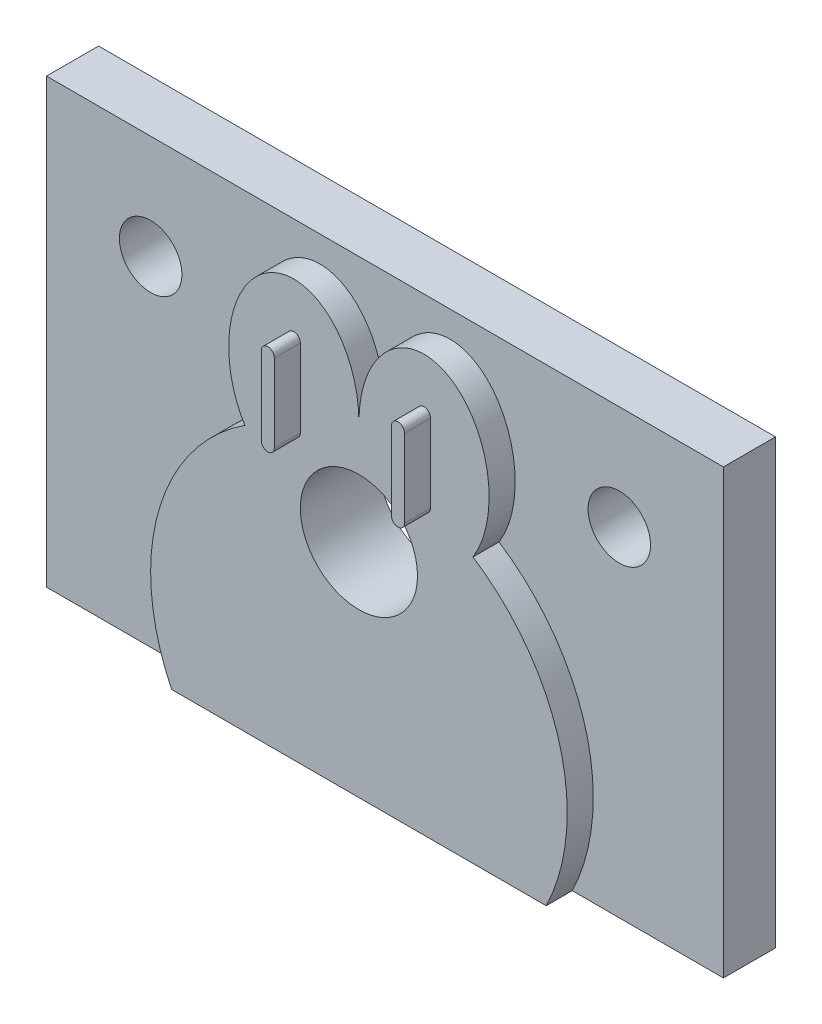
ISO-10303-21;
HEADER;
FILE_DESCRIPTION(('STEP AP214'),'2;1');
FILE_NAME('part.step','',(''),(''),'','','');
FILE_SCHEMA(('AUTOMOTIVE_DESIGN { 1 0 10303 214 1 1 1 1 }'));
ENDSEC;
DATA;
#1=APPLICATION_CONTEXT('core data for automotive mechanical design processes');
#2=APPLICATION_PROTOCOL_DEFINITION('international standard','automotive_design',2000,#1);
#3=PRODUCT_CONTEXT('',#1,'mechanical');
#4=PRODUCT('Part','Part','',(#3));
#5=PRODUCT_RELATED_PRODUCT_CATEGORY('part','',(#4));
#6=PRODUCT_DEFINITION_FORMATION('','',#4);
#7=PRODUCT_DEFINITION_CONTEXT('part definition',#1,'design');
#8=PRODUCT_DEFINITION('design','',#6,#7);
#9=PRODUCT_DEFINITION_SHAPE('','',#8);
#10=(LENGTH_UNIT() NAMED_UNIT(*) SI_UNIT(.MILLI.,.METRE.));
#11=(NAMED_UNIT(*) PLANE_ANGLE_UNIT() SI_UNIT($,.RADIAN.));
#12=(NAMED_UNIT(*) SI_UNIT($,.STERADIAN.) SOLID_ANGLE_UNIT());
#13=UNCERTAINTY_MEASURE_WITH_UNIT(LENGTH_MEASURE(1.E-05),#10,'distance_accuracy_value','');
#14=(GEOMETRIC_REPRESENTATION_CONTEXT(3) GLOBAL_UNCERTAINTY_ASSIGNED_CONTEXT((#13)) GLOBAL_UNIT_ASSIGNED_CONTEXT((#10,
#11,#12)) REPRESENTATION_CONTEXT('',''));
#15=CARTESIAN_POINT('',(0.,0.,0.));
#16=DIRECTION('',(0.,0.,1.));
#17=DIRECTION('',(1.,0.,0.));
#18=AXIS2_PLACEMENT_3D('',#15,#16,#17);
#19=CARTESIAN_POINT('',(-2.5,4.,1.));
#20=DIRECTION('',(0.,0.,1.));
#21=DIRECTION('',(1.,0.,0.));
#22=AXIS2_PLACEMENT_3D('',#19,#20,#21);
#23=PLANE('',#22);
#24=CARTESIAN_POINT('',(0.,0.,1.));
#25=DIRECTION('',(0.,0.,1.));
#26=DIRECTION('',(1.,0.,0.));
#27=AXIS2_PLACEMENT_3D('',#24,#25,#26);
#28=CIRCLE('',#27,2.25);
#29=CARTESIAN_POINT('',(2.25,0.,1.));
#30=VERTEX_POINT('',#29);
#31=EDGE_CURVE('E348',#30,#30,#28,.T.);
#32=ORIENTED_EDGE('',*,*,#31,.F.);
#33=EDGE_LOOP('',(#32));
#34=FACE_BOUND('',#33,.T.);
#35=CARTESIAN_POINT('',(0.,-5.,1.));
#36=DIRECTION('',(0.,0.,1.));
#37=DIRECTION('',(-1.,0.,0.));
#38=AXIS2_PLACEMENT_3D('',#35,#36,#37);
#39=CIRCLE('',#38,8.);
#40=CARTESIAN_POINT('',(-4.38067327137407,1.69400490659134,1.));
#41=VERTEX_POINT('',#40);
#42=CARTESIAN_POINT('',(-7.19374728496908,-8.5,1.));
#43=VERTEX_POINT('',#42);
#44=EDGE_CURVE('E241',#41,#43,#39,.T.);
#45=ORIENTED_EDGE('',*,*,#44,.T.);
#46=DIRECTION('',(1.,0.,0.));
#47=VECTOR('',#46,1.);
#48=CARTESIAN_POINT('',(-7.19374728496908,-8.5,1.));
#49=LINE('',#48,#47);
#50=CARTESIAN_POINT('',(7.19374728496908,-8.5,1.));
#51=VERTEX_POINT('',#50);
#52=EDGE_CURVE('E244',#43,#51,#49,.T.);
#53=ORIENTED_EDGE('',*,*,#52,.T.);
#54=CARTESIAN_POINT('',(0.,-5.,1.));
#55=DIRECTION('',(0.,0.,1.));
#56=DIRECTION('',(-1.,0.,0.));
#57=AXIS2_PLACEMENT_3D('',#54,#55,#56);
#58=CIRCLE('',#57,8.);
#59=CARTESIAN_POINT('',(4.38067327137405,1.69400490659134,1.));
#60=VERTEX_POINT('',#59);
#61=EDGE_CURVE('E247',#51,#60,#58,.T.);
#62=ORIENTED_EDGE('',*,*,#61,.T.);
#63=CARTESIAN_POINT('',(2.5,4.,1.));
#64=DIRECTION('',(0.,0.,1.));
#65=DIRECTION('',(0.,-1.,0.));
#66=AXIS2_PLACEMENT_3D('',#63,#64,#65);
#67=ELLIPSE('',#66,3.5,2.5);
#68=CARTESIAN_POINT('',(0.,4.,1.));
#69=VERTEX_POINT('',#68);
#70=EDGE_CURVE('E249',#60,#69,#67,.T.);
#71=ORIENTED_EDGE('',*,*,#70,.T.);
#72=CARTESIAN_POINT('',(-2.5,4.,1.));
#73=DIRECTION('',(0.,0.,1.));
#74=DIRECTION('',(0.,-1.,0.));
#75=AXIS2_PLACEMENT_3D('',#72,#73,#74);
#76=ELLIPSE('',#75,3.5,2.5);
#77=EDGE_CURVE('E252',#69,#41,#76,.T.);
#78=ORIENTED_EDGE('',*,*,#77,.T.);
#79=EDGE_LOOP('',(#45,#53,#62,#71,#78));
#80=FACE_BOUND('',#79,.T.);
#81=DIRECTION('',(0.,1.,0.));
#82=VECTOR('',#81,1.);
#83=CARTESIAN_POINT('',(-2.25000000000001,2.49999999999999,1.));
#84=LINE('',#83,#82);
#85=CARTESIAN_POINT('',(-2.25000000000001,2.49999999999999,1.));
#86=VERTEX_POINT('',#85);
#87=CARTESIAN_POINT('',(-2.25000000000001,5.49999999999999,1.));
#88=VERTEX_POINT('',#87);
#89=EDGE_CURVE('E227',#86,#88,#84,.T.);
#90=ORIENTED_EDGE('',*,*,#89,.F.);
#91=CARTESIAN_POINT('',(-2.50000000000001,2.49999999999999,1.));
#92=DIRECTION('',(0.,0.,1.));
#93=DIRECTION('',(1.,0.,0.));
#94=AXIS2_PLACEMENT_3D('',#91,#92,#93);
#95=CIRCLE('',#94,0.250000000000001);
#96=CARTESIAN_POINT('',(-2.75000000000002,2.49999999999999,1.));
#97=VERTEX_POINT('',#96);
#98=EDGE_CURVE('E213',#97,#86,#95,.T.);
#99=ORIENTED_EDGE('',*,*,#98,.F.);
#100=DIRECTION('',(0.,-1.,0.));
#101=VECTOR('',#100,1.);
#102=CARTESIAN_POINT('',(-2.75000000000002,2.49999999999999,1.));
#103=LINE('',#102,#101);
#104=CARTESIAN_POINT('',(-2.75000000000002,5.49999999999999,1.));
#105=VERTEX_POINT('',#104);
#106=EDGE_CURVE('E218',#105,#97,#103,.T.);
#107=ORIENTED_EDGE('',*,*,#106,.F.);
#108=CARTESIAN_POINT('',(-2.50000000000002,5.49999999999999,1.));
#109=DIRECTION('',(0.,0.,1.));
#110=DIRECTION('',(1.,0.,0.));
#111=AXIS2_PLACEMENT_3D('',#108,#109,#110);
#112=CIRCLE('',#111,0.250000000000001);
#113=EDGE_CURVE('E229',#88,#105,#112,.T.);
#114=ORIENTED_EDGE('',*,*,#113,.F.);
#115=EDGE_LOOP('',(#90,#99,#107,#114));
#116=FACE_BOUND('',#115,.T.);
#117=DIRECTION('',(0.,1.,0.));
#118=VECTOR('',#117,1.);
#119=CARTESIAN_POINT('',(2.74999999999999,2.49999999999999,1.));
#120=LINE('',#119,#118);
#121=CARTESIAN_POINT('',(2.74999999999999,2.49999999999999,1.));
#122=VERTEX_POINT('',#121);
#123=CARTESIAN_POINT('',(2.74999999999999,5.49999999999999,1.));
#124=VERTEX_POINT('',#123);
#125=EDGE_CURVE('E184',#122,#124,#120,.T.);
#126=ORIENTED_EDGE('',*,*,#125,.F.);
#127=CARTESIAN_POINT('',(2.49999999999999,2.49999999999999,1.));
#128=DIRECTION('',(0.,0.,1.));
#129=DIRECTION('',(1.,0.,0.));
#130=AXIS2_PLACEMENT_3D('',#127,#128,#129);
#131=CIRCLE('',#130,0.25);
#132=CARTESIAN_POINT('',(2.24999999999999,2.49999999999999,1.));
#133=VERTEX_POINT('',#132);
#134=EDGE_CURVE('E181',#133,#122,#131,.T.);
#135=ORIENTED_EDGE('',*,*,#134,.F.);
#136=DIRECTION('',(0.,-1.,0.));
#137=VECTOR('',#136,1.);
#138=CARTESIAN_POINT('',(2.24999999999999,2.49999999999999,1.));
#139=LINE('',#138,#137);
#140=CARTESIAN_POINT('',(2.24999999999999,5.49999999999999,1.));
#141=VERTEX_POINT('',#140);
#142=EDGE_CURVE('E194',#141,#133,#139,.T.);
#143=ORIENTED_EDGE('',*,*,#142,.F.);
#144=CARTESIAN_POINT('',(2.49999999999999,5.49999999999999,1.));
#145=DIRECTION('',(0.,0.,1.));
#146=DIRECTION('',(1.,0.,0.));
#147=AXIS2_PLACEMENT_3D('',#144,#145,#146);
#148=CIRCLE('',#147,0.25);
#149=EDGE_CURVE('E202',#124,#141,#148,.T.);
#150=ORIENTED_EDGE('',*,*,#149,.F.);
#151=EDGE_LOOP('',(#126,#135,#143,#150));
#152=FACE_BOUND('',#151,.T.);
#153=ADVANCED_FACE('F33',(#34,#80,#116,#152),#23,.T.);
#154=CARTESIAN_POINT('',(0.,-5.,1.));
#155=DIRECTION('',(0.,0.,-1.));
#156=DIRECTION('',(-1.,0.,0.));
#157=AXIS2_PLACEMENT_3D('',#154,#155,#156);
#158=CYLINDRICAL_SURFACE('',#157,8.);
#159=CARTESIAN_POINT('',(0.,-5.,0.));
#160=DIRECTION('',(0.,0.,1.));
#161=DIRECTION('',(-1.,0.,0.));
#162=AXIS2_PLACEMENT_3D('',#159,#160,#161);
#163=CIRCLE('',#162,8.);
#164=CARTESIAN_POINT('',(-4.38067327137407,1.69400490659134,0.));
#165=VERTEX_POINT('',#164);
#166=CARTESIAN_POINT('',(-7.19374728496908,-8.5,0.));
#167=VERTEX_POINT('',#166);
#168=EDGE_CURVE('E240',#165,#167,#163,.T.);
#169=ORIENTED_EDGE('',*,*,#168,.T.);
#170=DIRECTION('',(0.,0.,-1.));
#171=VECTOR('',#170,1.);
#172=CARTESIAN_POINT('',(-7.19374728496908,-8.5,1.));
#173=LINE('',#172,#171);
#174=EDGE_CURVE('E11',#43,#167,#173,.T.);
#175=ORIENTED_EDGE('',*,*,#174,.F.);
#176=ORIENTED_EDGE('',*,*,#44,.F.);
#177=DIRECTION('',(0.,0.,-1.));
#178=VECTOR('',#177,1.);
#179=CARTESIAN_POINT('',(-4.38067327137407,1.69400490659134,1.));
#180=LINE('',#179,#178);
#181=EDGE_CURVE('E395',#41,#165,#180,.T.);
#182=ORIENTED_EDGE('',*,*,#181,.T.);
#183=EDGE_LOOP('',(#169,#175,#176,#182));
#184=FACE_BOUND('',#183,.T.);
#185=ADVANCED_FACE('F35',(#184),#158,.T.);
#186=CARTESIAN_POINT('',(-7.19374728496908,-8.5,1.));
#187=DIRECTION('',(0.,1.,0.));
#188=DIRECTION('',(-1.,0.,0.));
#189=AXIS2_PLACEMENT_3D('',#186,#187,#188);
#190=PLANE('',#189);
#191=ORIENTED_EDGE('',*,*,#174,.T.);
#192=DIRECTION('',(-1.,0.,0.));
#193=VECTOR('',#192,1.);
#194=CARTESIAN_POINT('',(-13.,-8.5,0.));
#195=LINE('',#194,#193);
#196=CARTESIAN_POINT('',(-13.,-8.5,0.));
#197=VERTEX_POINT('',#196);
#198=EDGE_CURVE('E371',#167,#197,#195,.T.);
#199=ORIENTED_EDGE('',*,*,#198,.T.);
#200=DIRECTION('',(0.,0.,1.));
#201=VECTOR('',#200,1.);
#202=CARTESIAN_POINT('',(-13.,-8.5,-2.));
#203=LINE('',#202,#201);
#204=CARTESIAN_POINT('',(-13.,-8.5,-2.));
#205=VERTEX_POINT('',#204);
#206=EDGE_CURVE('E162',#205,#197,#203,.T.);
#207=ORIENTED_EDGE('',*,*,#206,.F.);
#208=DIRECTION('',(-1.,0.,0.));
#209=VECTOR('',#208,1.);
#210=CARTESIAN_POINT('',(-13.,-8.5,-2.));
#211=LINE('',#210,#209);
#212=CARTESIAN_POINT('',(13.,-8.5,-2.));
#213=VERTEX_POINT('',#212);
#214=EDGE_CURVE('E154',#213,#205,#211,.T.);
#215=ORIENTED_EDGE('',*,*,#214,.F.);
#216=DIRECTION('',(0.,0.,1.));
#217=VECTOR('',#216,1.);
#218=CARTESIAN_POINT('',(13.,-8.5,-2.));
#219=LINE('',#218,#217);
#220=CARTESIAN_POINT('',(13.,-8.5,0.));
#221=VERTEX_POINT('',#220);
#222=EDGE_CURVE('E159',#213,#221,#219,.T.);
#223=ORIENTED_EDGE('',*,*,#222,.T.);
#224=CARTESIAN_POINT('',(7.19374728496908,-8.5,0.));
#225=VERTEX_POINT('',#224);
#226=EDGE_CURVE('E372',#221,#225,#195,.T.);
#227=ORIENTED_EDGE('',*,*,#226,.T.);
#228=DIRECTION('',(0.,0.,-1.));
#229=VECTOR('',#228,1.);
#230=CARTESIAN_POINT('',(7.19374728496908,-8.5,1.));
#231=LINE('',#230,#229);
#232=EDGE_CURVE('E41',#51,#225,#231,.T.);
#233=ORIENTED_EDGE('',*,*,#232,.F.);
#234=ORIENTED_EDGE('',*,*,#52,.F.);
#235=EDGE_LOOP('',(#191,#199,#207,#215,#223,#227,#233,#234));
#236=FACE_BOUND('',#235,.T.);
#237=ADVANCED_FACE('F156',(#236),#190,.F.);
#238=CARTESIAN_POINT('',(0.,-5.,1.));
#239=DIRECTION('',(0.,0.,-1.));
#240=DIRECTION('',(-1.,0.,0.));
#241=AXIS2_PLACEMENT_3D('',#238,#239,#240);
#242=CYLINDRICAL_SURFACE('',#241,8.);
#243=CARTESIAN_POINT('',(0.,-5.,0.));
#244=DIRECTION('',(0.,0.,1.));
#245=DIRECTION('',(-1.,0.,0.));
#246=AXIS2_PLACEMENT_3D('',#243,#244,#245);
#247=CIRCLE('',#246,8.);
#248=CARTESIAN_POINT('',(4.38067327137405,1.69400490659134,0.));
#249=VERTEX_POINT('',#248);
#250=EDGE_CURVE('E383',#225,#249,#247,.T.);
#251=ORIENTED_EDGE('',*,*,#250,.T.);
#252=DIRECTION('',(0.,0.,-1.));
#253=VECTOR('',#252,1.);
#254=CARTESIAN_POINT('',(4.38067327137405,1.69400490659134,1.));
#255=LINE('',#254,#253);
#256=EDGE_CURVE('E389',#60,#249,#255,.T.);
#257=ORIENTED_EDGE('',*,*,#256,.F.);
#258=ORIENTED_EDGE('',*,*,#61,.F.);
#259=ORIENTED_EDGE('',*,*,#232,.T.);
#260=EDGE_LOOP('',(#251,#257,#258,#259));
#261=FACE_BOUND('',#260,.T.);
#262=ADVANCED_FACE('F261',(#261),#242,.T.);
#263=DIRECTION('',(0.,0.,-1.));
#264=VECTOR('',#263,1.);
#265=SURFACE_OF_LINEAR_EXTRUSION('',#67,#264);
#266=CARTESIAN_POINT('',(2.5,4.,0.));
#267=DIRECTION('',(0.,0.,1.));
#268=DIRECTION('',(0.,-1.,0.));
#269=AXIS2_PLACEMENT_3D('',#266,#267,#268);
#270=ELLIPSE('',#269,3.5,2.5);
#271=CARTESIAN_POINT('',(0.,4.,0.));
#272=VERTEX_POINT('',#271);
#273=EDGE_CURVE('E400',#249,#272,#270,.T.);
#274=ORIENTED_EDGE('',*,*,#273,.T.);
#275=DIRECTION('',(0.,0.,-1.));
#276=VECTOR('',#275,1.);
#277=CARTESIAN_POINT('',(0.,4.,1.));
#278=LINE('',#277,#276);
#279=EDGE_CURVE('E390',#69,#272,#278,.T.);
#280=ORIENTED_EDGE('',*,*,#279,.F.);
#281=ORIENTED_EDGE('',*,*,#70,.F.);
#282=ORIENTED_EDGE('',*,*,#256,.T.);
#283=EDGE_LOOP('',(#274,#280,#281,#282));
#284=FACE_BOUND('',#283,.T.);
#285=ADVANCED_FACE('F256',(#284),#265,.F.);
#286=DIRECTION('',(0.,0.,-1.));
#287=VECTOR('',#286,1.);
#288=SURFACE_OF_LINEAR_EXTRUSION('',#76,#287);
#289=CARTESIAN_POINT('',(-2.5,4.,0.));
#290=DIRECTION('',(0.,0.,1.));
#291=DIRECTION('',(0.,-1.,0.));
#292=AXIS2_PLACEMENT_3D('',#289,#290,#291);
#293=ELLIPSE('',#292,3.5,2.5);
#294=EDGE_CURVE('E245',#272,#165,#293,.T.);
#295=ORIENTED_EDGE('',*,*,#294,.T.);
#296=ORIENTED_EDGE('',*,*,#181,.F.);
#297=ORIENTED_EDGE('',*,*,#77,.F.);
#298=ORIENTED_EDGE('',*,*,#279,.T.);
#299=EDGE_LOOP('',(#295,#296,#297,#298));
#300=FACE_BOUND('',#299,.T.);
#301=ADVANCED_FACE('F260',(#300),#288,.F.);
#302=CARTESIAN_POINT('',(-2.50000000000001,2.49999999999999,2.));
#303=DIRECTION('',(0.,0.,-1.));
#304=DIRECTION('',(-1.,0.,0.));
#305=AXIS2_PLACEMENT_3D('',#302,#303,#304);
#306=CYLINDRICAL_SURFACE('',#305,0.250000000000001);
#307=ORIENTED_EDGE('',*,*,#98,.T.);
#308=DIRECTION('',(0.,0.,-1.));
#309=VECTOR('',#308,1.);
#310=CARTESIAN_POINT('',(-2.25000000000001,2.49999999999999,2.));
#311=LINE('',#310,#309);
#312=CARTESIAN_POINT('',(-2.25000000000001,2.49999999999999,2.));
#313=VERTEX_POINT('',#312);
#314=EDGE_CURVE('E238',#313,#86,#311,.T.);
#315=ORIENTED_EDGE('',*,*,#314,.F.);
#316=CARTESIAN_POINT('',(-2.50000000000001,2.49999999999999,2.));
#317=DIRECTION('',(0.,0.,1.));
#318=DIRECTION('',(1.,0.,0.));
#319=AXIS2_PLACEMENT_3D('',#316,#317,#318);
#320=CIRCLE('',#319,0.250000000000001);
#321=CARTESIAN_POINT('',(-2.75000000000002,2.49999999999999,2.));
#322=VERTEX_POINT('',#321);
#323=EDGE_CURVE('E214',#322,#313,#320,.T.);
#324=ORIENTED_EDGE('',*,*,#323,.F.);
#325=DIRECTION('',(0.,0.,-1.));
#326=VECTOR('',#325,1.);
#327=CARTESIAN_POINT('',(-2.75000000000002,2.49999999999999,2.));
#328=LINE('',#327,#326);
#329=EDGE_CURVE('E224',#322,#97,#328,.T.);
#330=ORIENTED_EDGE('',*,*,#329,.T.);
#331=EDGE_LOOP('',(#307,#315,#324,#330));
#332=FACE_BOUND('',#331,.T.);
#333=ADVANCED_FACE('F278',(#332),#306,.T.);
#334=CARTESIAN_POINT('',(-2.25000000000001,2.49999999999999,2.));
#335=DIRECTION('',(-1.,0.,0.));
#336=DIRECTION('',(0.,-1.,0.));
#337=AXIS2_PLACEMENT_3D('',#334,#335,#336);
#338=PLANE('',#337);
#339=ORIENTED_EDGE('',*,*,#89,.T.);
#340=DIRECTION('',(0.,0.,-1.));
#341=VECTOR('',#340,1.);
#342=CARTESIAN_POINT('',(-2.25000000000001,5.49999999999999,2.));
#343=LINE('',#342,#341);
#344=CARTESIAN_POINT('',(-2.25000000000001,5.49999999999999,2.));
#345=VERTEX_POINT('',#344);
#346=EDGE_CURVE('E235',#345,#88,#343,.T.);
#347=ORIENTED_EDGE('',*,*,#346,.F.);
#348=DIRECTION('',(0.,1.,0.));
#349=VECTOR('',#348,1.);
#350=CARTESIAN_POINT('',(-2.25000000000001,2.49999999999999,2.));
#351=LINE('',#350,#349);
#352=EDGE_CURVE('E217',#313,#345,#351,.T.);
#353=ORIENTED_EDGE('',*,*,#352,.F.);
#354=ORIENTED_EDGE('',*,*,#314,.T.);
#355=EDGE_LOOP('',(#339,#347,#353,#354));
#356=FACE_BOUND('',#355,.T.);
#357=ADVANCED_FACE('F281',(#356),#338,.F.);
#358=CARTESIAN_POINT('',(-2.50000000000002,5.49999999999999,2.));
#359=DIRECTION('',(0.,0.,-1.));
#360=DIRECTION('',(-1.,0.,0.));
#361=AXIS2_PLACEMENT_3D('',#358,#359,#360);
#362=CYLINDRICAL_SURFACE('',#361,0.250000000000001);
#363=ORIENTED_EDGE('',*,*,#113,.T.);
#364=DIRECTION('',(0.,0.,-1.));
#365=VECTOR('',#364,1.);
#366=CARTESIAN_POINT('',(-2.75000000000002,5.49999999999999,2.));
#367=LINE('',#366,#365);
#368=CARTESIAN_POINT('',(-2.75000000000002,5.49999999999999,2.));
#369=VERTEX_POINT('',#368);
#370=EDGE_CURVE('E56',#369,#105,#367,.T.);
#371=ORIENTED_EDGE('',*,*,#370,.F.);
#372=CARTESIAN_POINT('',(-2.50000000000002,5.49999999999999,2.));
#373=DIRECTION('',(0.,0.,1.));
#374=DIRECTION('',(1.,0.,0.));
#375=AXIS2_PLACEMENT_3D('',#372,#373,#374);
#376=CIRCLE('',#375,0.250000000000001);
#377=EDGE_CURVE('E220',#345,#369,#376,.T.);
#378=ORIENTED_EDGE('',*,*,#377,.F.);
#379=ORIENTED_EDGE('',*,*,#346,.T.);
#380=EDGE_LOOP('',(#363,#371,#378,#379));
#381=FACE_BOUND('',#380,.T.);
#382=ADVANCED_FACE('F285',(#381),#362,.T.);
#383=CARTESIAN_POINT('',(-2.75000000000002,2.49999999999999,2.));
#384=DIRECTION('',(1.,0.,0.));
#385=DIRECTION('',(0.,1.,0.));
#386=AXIS2_PLACEMENT_3D('',#383,#384,#385);
#387=PLANE('',#386);
#388=ORIENTED_EDGE('',*,*,#106,.T.);
#389=ORIENTED_EDGE('',*,*,#329,.F.);
#390=DIRECTION('',(0.,-1.,0.));
#391=VECTOR('',#390,1.);
#392=CARTESIAN_POINT('',(-2.75000000000002,2.49999999999999,2.));
#393=LINE('',#392,#391);
#394=EDGE_CURVE('E222',#369,#322,#393,.T.);
#395=ORIENTED_EDGE('',*,*,#394,.F.);
#396=ORIENTED_EDGE('',*,*,#370,.T.);
#397=EDGE_LOOP('',(#388,#389,#395,#396));
#398=FACE_BOUND('',#397,.T.);
#399=ADVANCED_FACE('F289',(#398),#387,.F.);
#400=CARTESIAN_POINT('',(-2.50000000000001,2.49999999999999,2.));
#401=DIRECTION('',(0.,0.,1.));
#402=DIRECTION('',(1.,0.,0.));
#403=AXIS2_PLACEMENT_3D('',#400,#401,#402);
#404=PLANE('',#403);
#405=ORIENTED_EDGE('',*,*,#323,.T.);
#406=ORIENTED_EDGE('',*,*,#352,.T.);
#407=ORIENTED_EDGE('',*,*,#377,.T.);
#408=ORIENTED_EDGE('',*,*,#394,.T.);
#409=EDGE_LOOP('',(#405,#406,#407,#408));
#410=FACE_BOUND('',#409,.T.);
#411=ADVANCED_FACE('F293',(#410),#404,.T.);
#412=CARTESIAN_POINT('',(2.49999999999999,2.49999999999999,2.));
#413=DIRECTION('',(0.,0.,-1.));
#414=DIRECTION('',(-1.,0.,0.));
#415=AXIS2_PLACEMENT_3D('',#412,#413,#414);
#416=CYLINDRICAL_SURFACE('',#415,0.25);
#417=ORIENTED_EDGE('',*,*,#134,.T.);
#418=DIRECTION('',(0.,0.,-1.));
#419=VECTOR('',#418,1.);
#420=CARTESIAN_POINT('',(2.74999999999999,2.49999999999999,2.));
#421=LINE('',#420,#419);
#422=CARTESIAN_POINT('',(2.74999999999999,2.49999999999999,2.));
#423=VERTEX_POINT('',#422);
#424=EDGE_CURVE('E211',#423,#122,#421,.T.);
#425=ORIENTED_EDGE('',*,*,#424,.F.);
#426=CARTESIAN_POINT('',(2.49999999999999,2.49999999999999,2.));
#427=DIRECTION('',(0.,0.,1.));
#428=DIRECTION('',(1.,0.,0.));
#429=AXIS2_PLACEMENT_3D('',#426,#427,#428);
#430=CIRCLE('',#429,0.25);
#431=CARTESIAN_POINT('',(2.24999999999999,2.49999999999999,2.));
#432=VERTEX_POINT('',#431);
#433=EDGE_CURVE('E190',#432,#423,#430,.T.);
#434=ORIENTED_EDGE('',*,*,#433,.F.);
#435=DIRECTION('',(0.,0.,-1.));
#436=VECTOR('',#435,1.);
#437=CARTESIAN_POINT('',(2.24999999999999,2.49999999999999,2.));
#438=LINE('',#437,#436);
#439=EDGE_CURVE('E199',#432,#133,#438,.T.);
#440=ORIENTED_EDGE('',*,*,#439,.T.);
#441=EDGE_LOOP('',(#417,#425,#434,#440));
#442=FACE_BOUND('',#441,.T.);
#443=ADVANCED_FACE('F296',(#442),#416,.T.);
#444=CARTESIAN_POINT('',(2.74999999999999,2.49999999999999,2.));
#445=DIRECTION('',(-1.,0.,0.));
#446=DIRECTION('',(0.,-1.,0.));
#447=AXIS2_PLACEMENT_3D('',#444,#445,#446);
#448=PLANE('',#447);
#449=ORIENTED_EDGE('',*,*,#125,.T.);
#450=DIRECTION('',(0.,0.,-1.));
#451=VECTOR('',#450,1.);
#452=CARTESIAN_POINT('',(2.74999999999999,5.49999999999999,2.));
#453=LINE('',#452,#451);
#454=CARTESIAN_POINT('',(2.74999999999999,5.49999999999999,2.));
#455=VERTEX_POINT('',#454);
#456=EDGE_CURVE('E208',#455,#124,#453,.T.);
#457=ORIENTED_EDGE('',*,*,#456,.F.);
#458=DIRECTION('',(0.,1.,0.));
#459=VECTOR('',#458,1.);
#460=CARTESIAN_POINT('',(2.74999999999999,2.49999999999999,2.));
#461=LINE('',#460,#459);
#462=EDGE_CURVE('E193',#423,#455,#461,.T.);
#463=ORIENTED_EDGE('',*,*,#462,.F.);
#464=ORIENTED_EDGE('',*,*,#424,.T.);
#465=EDGE_LOOP('',(#449,#457,#463,#464));
#466=FACE_BOUND('',#465,.T.);
#467=ADVANCED_FACE('F300',(#466),#448,.F.);
#468=CARTESIAN_POINT('',(2.49999999999999,5.49999999999999,2.));
#469=DIRECTION('',(0.,0.,-1.));
#470=DIRECTION('',(-1.,0.,0.));
#471=AXIS2_PLACEMENT_3D('',#468,#469,#470);
#472=CYLINDRICAL_SURFACE('',#471,0.25);
#473=ORIENTED_EDGE('',*,*,#149,.T.);
#474=DIRECTION('',(0.,0.,-1.));
#475=VECTOR('',#474,1.);
#476=CARTESIAN_POINT('',(2.24999999999999,5.49999999999999,2.));
#477=LINE('',#476,#475);
#478=CARTESIAN_POINT('',(2.24999999999999,5.49999999999999,2.));
#479=VERTEX_POINT('',#478);
#480=EDGE_CURVE('E48',#479,#141,#477,.T.);
#481=ORIENTED_EDGE('',*,*,#480,.F.);
#482=CARTESIAN_POINT('',(2.49999999999999,5.49999999999999,2.));
#483=DIRECTION('',(0.,0.,1.));
#484=DIRECTION('',(1.,0.,0.));
#485=AXIS2_PLACEMENT_3D('',#482,#483,#484);
#486=CIRCLE('',#485,0.25);
#487=EDGE_CURVE('E196',#455,#479,#486,.T.);
#488=ORIENTED_EDGE('',*,*,#487,.F.);
#489=ORIENTED_EDGE('',*,*,#456,.T.);
#490=EDGE_LOOP('',(#473,#481,#488,#489));
#491=FACE_BOUND('',#490,.T.);
#492=ADVANCED_FACE('F304',(#491),#472,.T.);
#493=CARTESIAN_POINT('',(2.24999999999999,2.49999999999999,2.));
#494=DIRECTION('',(1.,0.,0.));
#495=DIRECTION('',(0.,1.,0.));
#496=AXIS2_PLACEMENT_3D('',#493,#494,#495);
#497=PLANE('',#496);
#498=ORIENTED_EDGE('',*,*,#142,.T.);
#499=ORIENTED_EDGE('',*,*,#439,.F.);
#500=DIRECTION('',(0.,-1.,0.));
#501=VECTOR('',#500,1.);
#502=CARTESIAN_POINT('',(2.24999999999999,2.49999999999999,2.));
#503=LINE('',#502,#501);
#504=EDGE_CURVE('E198',#479,#432,#503,.T.);
#505=ORIENTED_EDGE('',*,*,#504,.F.);
#506=ORIENTED_EDGE('',*,*,#480,.T.);
#507=EDGE_LOOP('',(#498,#499,#505,#506));
#508=FACE_BOUND('',#507,.T.);
#509=ADVANCED_FACE('F308',(#508),#497,.F.);
#510=CARTESIAN_POINT('',(2.49999999999999,2.49999999999999,2.));
#511=DIRECTION('',(0.,0.,1.));
#512=DIRECTION('',(1.,0.,0.));
#513=AXIS2_PLACEMENT_3D('',#510,#511,#512);
#514=PLANE('',#513);
#515=ORIENTED_EDGE('',*,*,#433,.T.);
#516=ORIENTED_EDGE('',*,*,#462,.T.);
#517=ORIENTED_EDGE('',*,*,#487,.T.);
#518=ORIENTED_EDGE('',*,*,#504,.T.);
#519=EDGE_LOOP('',(#515,#516,#517,#518));
#520=FACE_BOUND('',#519,.T.);
#521=ADVANCED_FACE('F312',(#520),#514,.T.);
#522=CARTESIAN_POINT('',(0.,0.,-2.));
#523=DIRECTION('',(0.,0.,1.));
#524=DIRECTION('',(1.,0.,0.));
#525=AXIS2_PLACEMENT_3D('',#522,#523,#524);
#526=PLANE('',#525);
#527=CARTESIAN_POINT('',(0.,0.,-2.));
#528=DIRECTION('',(0.,0.,1.));
#529=DIRECTION('',(1.,0.,0.));
#530=AXIS2_PLACEMENT_3D('',#527,#528,#529);
#531=CIRCLE('',#530,2.25);
#532=CARTESIAN_POINT('',(2.25,0.,-2.));
#533=VERTEX_POINT('',#532);
#534=EDGE_CURVE('E351',#533,#533,#531,.T.);
#535=ORIENTED_EDGE('',*,*,#534,.T.);
#536=EDGE_LOOP('',(#535));
#537=FACE_BOUND('',#536,.T.);
#538=DIRECTION('',(0.,-1.,0.));
#539=VECTOR('',#538,1.);
#540=CARTESIAN_POINT('',(13.,8.5,-2.));
#541=LINE('',#540,#539);
#542=CARTESIAN_POINT('',(13.,8.5,-2.));
#543=VERTEX_POINT('',#542);
#544=EDGE_CURVE('E166',#543,#213,#541,.T.);
#545=ORIENTED_EDGE('',*,*,#544,.T.);
#546=ORIENTED_EDGE('',*,*,#214,.T.);
#547=DIRECTION('',(0.,1.,0.));
#548=VECTOR('',#547,1.);
#549=CARTESIAN_POINT('',(-13.,8.5,-2.));
#550=LINE('',#549,#548);
#551=CARTESIAN_POINT('',(-13.,8.5,-2.));
#552=VERTEX_POINT('',#551);
#553=EDGE_CURVE('E165',#205,#552,#550,.T.);
#554=ORIENTED_EDGE('',*,*,#553,.T.);
#555=DIRECTION('',(1.,0.,0.));
#556=VECTOR('',#555,1.);
#557=CARTESIAN_POINT('',(-13.,8.5,-2.));
#558=LINE('',#557,#556);
#559=EDGE_CURVE('E172',#552,#543,#558,.T.);
#560=ORIENTED_EDGE('',*,*,#559,.T.);
#561=EDGE_LOOP('',(#545,#546,#554,#560));
#562=FACE_BOUND('',#561,.T.);
#563=CARTESIAN_POINT('',(9.,4.5,-2.));
#564=DIRECTION('',(0.,0.,-1.));
#565=DIRECTION('',(-1.,0.,0.));
#566=AXIS2_PLACEMENT_3D('',#563,#564,#565);
#567=CIRCLE('',#566,1.2);
#568=CARTESIAN_POINT('',(7.8,4.5,-2.));
#569=VERTEX_POINT('',#568);
#570=EDGE_CURVE('E362',#569,#569,#567,.T.);
#571=ORIENTED_EDGE('',*,*,#570,.F.);
#572=EDGE_LOOP('',(#571));
#573=FACE_BOUND('',#572,.T.);
#574=CARTESIAN_POINT('',(-8.99999999999999,4.5,-2.));
#575=DIRECTION('',(0.,0.,-1.));
#576=DIRECTION('',(-1.,0.,0.));
#577=AXIS2_PLACEMENT_3D('',#574,#575,#576);
#578=CIRCLE('',#577,1.2);
#579=CARTESIAN_POINT('',(-10.2,4.5,-2.));
#580=VERTEX_POINT('',#579);
#581=EDGE_CURVE('E356',#580,#580,#578,.T.);
#582=ORIENTED_EDGE('',*,*,#581,.F.);
#583=EDGE_LOOP('',(#582));
#584=FACE_BOUND('',#583,.T.);
#585=ADVANCED_FACE('F169',(#537,#562,#573,#584),#526,.F.);
#586=CARTESIAN_POINT('',(0.,0.,0.));
#587=DIRECTION('',(0.,0.,1.));
#588=DIRECTION('',(1.,0.,0.));
#589=AXIS2_PLACEMENT_3D('',#586,#587,#588);
#590=PLANE('',#589);
#591=ORIENTED_EDGE('',*,*,#168,.F.);
#592=ORIENTED_EDGE('',*,*,#294,.F.);
#593=ORIENTED_EDGE('',*,*,#273,.F.);
#594=ORIENTED_EDGE('',*,*,#250,.F.);
#595=ORIENTED_EDGE('',*,*,#226,.F.);
#596=DIRECTION('',(0.,-1.,0.));
#597=VECTOR('',#596,1.);
#598=CARTESIAN_POINT('',(13.,8.5,0.));
#599=LINE('',#598,#597);
#600=CARTESIAN_POINT('',(13.,8.5,0.));
#601=VERTEX_POINT('',#600);
#602=EDGE_CURVE('E180',#601,#221,#599,.T.);
#603=ORIENTED_EDGE('',*,*,#602,.F.);
#604=DIRECTION('',(1.,0.,0.));
#605=VECTOR('',#604,1.);
#606=CARTESIAN_POINT('',(-13.,8.5,0.));
#607=LINE('',#606,#605);
#608=CARTESIAN_POINT('',(-13.,8.5,0.));
#609=VERTEX_POINT('',#608);
#610=EDGE_CURVE('E176',#609,#601,#607,.T.);
#611=ORIENTED_EDGE('',*,*,#610,.F.);
#612=DIRECTION('',(0.,1.,0.));
#613=VECTOR('',#612,1.);
#614=CARTESIAN_POINT('',(-13.,8.5,0.));
#615=LINE('',#614,#613);
#616=EDGE_CURVE('E374',#197,#609,#615,.T.);
#617=ORIENTED_EDGE('',*,*,#616,.F.);
#618=ORIENTED_EDGE('',*,*,#198,.F.);
#619=EDGE_LOOP('',(#591,#592,#593,#594,#595,#603,#611,#617,#618));
#620=FACE_BOUND('',#619,.T.);
#621=CARTESIAN_POINT('',(9.,4.5,0.));
#622=DIRECTION('',(0.,0.,-1.));
#623=DIRECTION('',(-1.,0.,0.));
#624=AXIS2_PLACEMENT_3D('',#621,#622,#623);
#625=CIRCLE('',#624,1.2);
#626=CARTESIAN_POINT('',(7.8,4.5,0.));
#627=VERTEX_POINT('',#626);
#628=EDGE_CURVE('E359',#627,#627,#625,.T.);
#629=ORIENTED_EDGE('',*,*,#628,.T.);
#630=EDGE_LOOP('',(#629));
#631=FACE_BOUND('',#630,.T.);
#632=CARTESIAN_POINT('',(-8.99999999999999,4.5,0.));
#633=DIRECTION('',(0.,0.,-1.));
#634=DIRECTION('',(-1.,0.,0.));
#635=AXIS2_PLACEMENT_3D('',#632,#633,#634);
#636=CIRCLE('',#635,1.2);
#637=CARTESIAN_POINT('',(-10.2,4.5,0.));
#638=VERTEX_POINT('',#637);
#639=EDGE_CURVE('E353',#638,#638,#636,.T.);
#640=ORIENTED_EDGE('',*,*,#639,.T.);
#641=EDGE_LOOP('',(#640));
#642=FACE_BOUND('',#641,.T.);
#643=ADVANCED_FACE('F319',(#620,#631,#642),#590,.T.);
#644=CARTESIAN_POINT('',(13.,8.5,-2.));
#645=DIRECTION('',(-1.,0.,0.));
#646=DIRECTION('',(0.,-1.,0.));
#647=AXIS2_PLACEMENT_3D('',#644,#645,#646);
#648=PLANE('',#647);
#649=ORIENTED_EDGE('',*,*,#602,.T.);
#650=ORIENTED_EDGE('',*,*,#222,.F.);
#651=ORIENTED_EDGE('',*,*,#544,.F.);
#652=DIRECTION('',(0.,0.,1.));
#653=VECTOR('',#652,1.);
#654=CARTESIAN_POINT('',(13.,8.5,-2.));
#655=LINE('',#654,#653);
#656=EDGE_CURVE('E369',#543,#601,#655,.T.);
#657=ORIENTED_EDGE('',*,*,#656,.T.);
#658=EDGE_LOOP('',(#649,#650,#651,#657));
#659=FACE_BOUND('',#658,.T.);
#660=ADVANCED_FACE('F178',(#659),#648,.F.);
#661=CARTESIAN_POINT('',(-13.,8.5,-2.));
#662=DIRECTION('',(1.,0.,0.));
#663=DIRECTION('',(0.,1.,0.));
#664=AXIS2_PLACEMENT_3D('',#661,#662,#663);
#665=PLANE('',#664);
#666=ORIENTED_EDGE('',*,*,#616,.T.);
#667=DIRECTION('',(0.,0.,1.));
#668=VECTOR('',#667,1.);
#669=CARTESIAN_POINT('',(-13.,8.5,-2.));
#670=LINE('',#669,#668);
#671=EDGE_CURVE('E186',#552,#609,#670,.T.);
#672=ORIENTED_EDGE('',*,*,#671,.F.);
#673=ORIENTED_EDGE('',*,*,#553,.F.);
#674=ORIENTED_EDGE('',*,*,#206,.T.);
#675=EDGE_LOOP('',(#666,#672,#673,#674));
#676=FACE_BOUND('',#675,.T.);
#677=ADVANCED_FACE('F318',(#676),#665,.F.);
#678=CARTESIAN_POINT('',(-13.,8.5,-2.));
#679=DIRECTION('',(0.,-1.,0.));
#680=DIRECTION('',(1.,0.,0.));
#681=AXIS2_PLACEMENT_3D('',#678,#679,#680);
#682=PLANE('',#681);
#683=ORIENTED_EDGE('',*,*,#610,.T.);
#684=ORIENTED_EDGE('',*,*,#656,.F.);
#685=ORIENTED_EDGE('',*,*,#559,.F.);
#686=ORIENTED_EDGE('',*,*,#671,.T.);
#687=EDGE_LOOP('',(#683,#684,#685,#686));
#688=FACE_BOUND('',#687,.T.);
#689=ADVANCED_FACE('F322',(#688),#682,.F.);
#690=CARTESIAN_POINT('',(9.,4.5,-2.));
#691=DIRECTION('',(0.,0.,1.));
#692=DIRECTION('',(1.,0.,0.));
#693=AXIS2_PLACEMENT_3D('',#690,#691,#692);
#694=CYLINDRICAL_SURFACE('',#693,1.2);
#695=ORIENTED_EDGE('',*,*,#570,.T.);
#696=EDGE_LOOP('',(#695));
#697=FACE_BOUND('',#696,.T.);
#698=ORIENTED_EDGE('',*,*,#628,.F.);
#699=EDGE_LOOP('',(#698));
#700=FACE_BOUND('',#699,.T.);
#701=ADVANCED_FACE('F326',(#697,#700),#694,.F.);
#702=CARTESIAN_POINT('',(-8.99999999999999,4.5,-2.));
#703=DIRECTION('',(0.,0.,1.));
#704=DIRECTION('',(1.,0.,0.));
#705=AXIS2_PLACEMENT_3D('',#702,#703,#704);
#706=CYLINDRICAL_SURFACE('',#705,1.2);
#707=ORIENTED_EDGE('',*,*,#581,.T.);
#708=EDGE_LOOP('',(#707));
#709=FACE_BOUND('',#708,.T.);
#710=ORIENTED_EDGE('',*,*,#639,.F.);
#711=EDGE_LOOP('',(#710));
#712=FACE_BOUND('',#711,.T.);
#713=ADVANCED_FACE('F336',(#709,#712),#706,.F.);
#714=CARTESIAN_POINT('',(0.,0.,-2.));
#715=DIRECTION('',(0.,0.,1.));
#716=DIRECTION('',(1.,0.,0.));
#717=AXIS2_PLACEMENT_3D('',#714,#715,#716);
#718=CYLINDRICAL_SURFACE('',#717,2.25);
#719=ORIENTED_EDGE('',*,*,#31,.T.);
#720=EDGE_LOOP('',(#719));
#721=FACE_BOUND('',#720,.T.);
#722=ORIENTED_EDGE('',*,*,#534,.F.);
#723=EDGE_LOOP('',(#722));
#724=FACE_BOUND('',#723,.T.);
#725=ADVANCED_FACE('F340',(#721,#724),#718,.F.);
#726=CLOSED_SHELL('',(#153,#185,#237,#262,#285,#301,#333,#357,#382,#399,#411,#443,#467,#492,
#509,#521,#585,#643,#660,#677,#689,#701,#713,#725));
#727=MANIFOLD_SOLID_BREP('B2',#726);
#728=ADVANCED_BREP_SHAPE_REPRESENTATION('',(#18,#727),#14);
#729=SHAPE_DEFINITION_REPRESENTATION(#9,#728);
ENDSEC;
END-ISO-10303-21;
